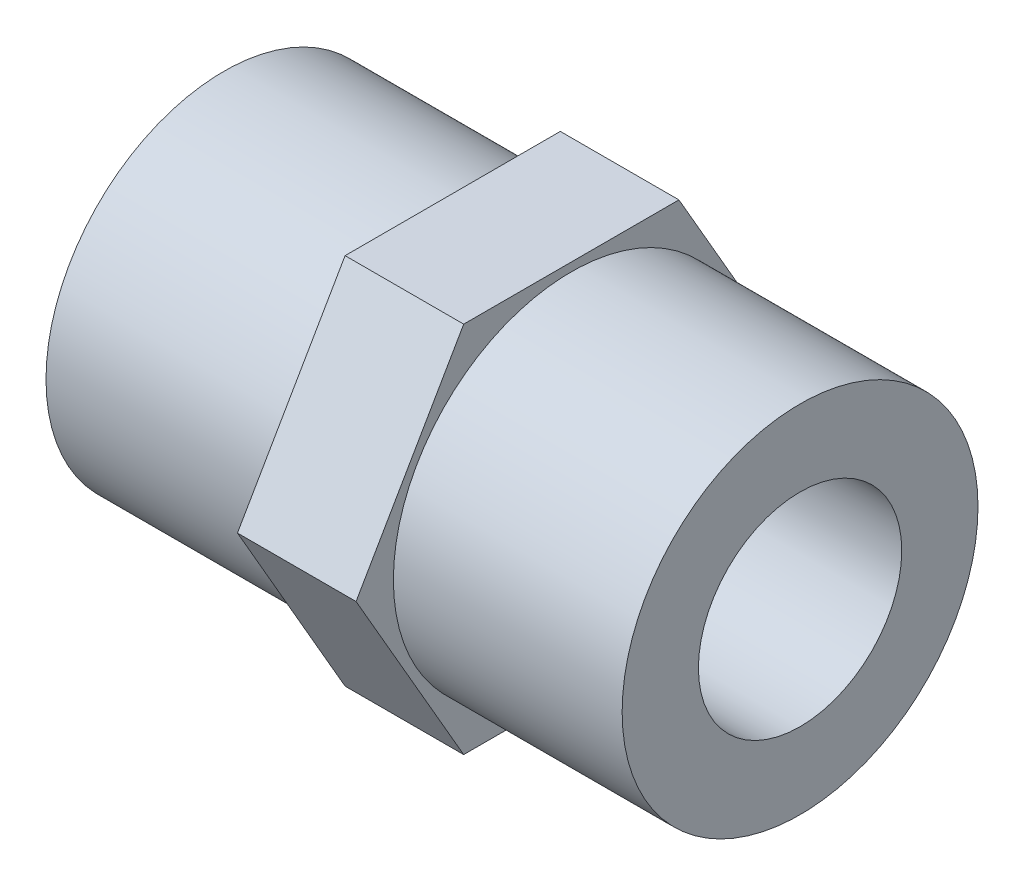
ISO-10303-21;
HEADER;
FILE_DESCRIPTION(('STEP AP214'),'2;1');
FILE_NAME('part.step','',(''),(''),'','','');
FILE_SCHEMA(('AUTOMOTIVE_DESIGN { 1 0 10303 214 1 1 1 1 }'));
ENDSEC;
DATA;
#1=APPLICATION_CONTEXT('core data for automotive mechanical design processes');
#2=APPLICATION_PROTOCOL_DEFINITION('international standard','automotive_design',2000,#1);
#3=PRODUCT_CONTEXT('',#1,'mechanical');
#4=PRODUCT('Part','Part','',(#3));
#5=PRODUCT_RELATED_PRODUCT_CATEGORY('part','',(#4));
#6=PRODUCT_DEFINITION_FORMATION('','',#4);
#7=PRODUCT_DEFINITION_CONTEXT('part definition',#1,'design');
#8=PRODUCT_DEFINITION('design','',#6,#7);
#9=PRODUCT_DEFINITION_SHAPE('','',#8);
#10=(LENGTH_UNIT() NAMED_UNIT(*) SI_UNIT(.MILLI.,.METRE.));
#11=(NAMED_UNIT(*) PLANE_ANGLE_UNIT() SI_UNIT($,.RADIAN.));
#12=(NAMED_UNIT(*) SI_UNIT($,.STERADIAN.) SOLID_ANGLE_UNIT());
#13=UNCERTAINTY_MEASURE_WITH_UNIT(LENGTH_MEASURE(1.E-05),#10,'distance_accuracy_value','');
#14=(GEOMETRIC_REPRESENTATION_CONTEXT(3) GLOBAL_UNCERTAINTY_ASSIGNED_CONTEXT((#13)) GLOBAL_UNIT_ASSIGNED_CONTEXT((#10,
#11,#12)) REPRESENTATION_CONTEXT('',''));
#15=CARTESIAN_POINT('',(0.,0.,0.));
#16=DIRECTION('',(0.,0.,1.));
#17=DIRECTION('',(1.,0.,0.));
#18=AXIS2_PLACEMENT_3D('',#15,#16,#17);
#19=CARTESIAN_POINT('',(0.,0.,0.));
#20=DIRECTION('',(-1.,0.,0.));
#21=DIRECTION('',(0.,0.,1.));
#22=AXIS2_PLACEMENT_3D('',#19,#20,#21);
#23=CYLINDRICAL_SURFACE('',#22,6.);
#24=CARTESIAN_POINT('',(34.,0.,0.));
#25=DIRECTION('',(-1.,0.,0.));
#26=DIRECTION('',(0.,0.,1.));
#27=AXIS2_PLACEMENT_3D('',#24,#25,#26);
#28=CIRCLE('',#27,6.);
#29=CARTESIAN_POINT('',(34.,0.,6.));
#30=VERTEX_POINT('',#29);
#31=EDGE_CURVE('E140',#30,#30,#28,.T.);
#32=ORIENTED_EDGE('',*,*,#31,.F.);
#33=EDGE_LOOP('',(#32));
#34=FACE_BOUND('',#33,.T.);
#35=CARTESIAN_POINT('',(0.,0.,0.));
#36=DIRECTION('',(-1.,0.,0.));
#37=DIRECTION('',(0.,0.,1.));
#38=AXIS2_PLACEMENT_3D('',#35,#36,#37);
#39=CIRCLE('',#38,6.);
#40=CARTESIAN_POINT('',(0.,0.,6.));
#41=VERTEX_POINT('',#40);
#42=EDGE_CURVE('E11',#41,#41,#39,.T.);
#43=ORIENTED_EDGE('',*,*,#42,.T.);
#44=EDGE_LOOP('',(#43));
#45=FACE_BOUND('',#44,.T.);
#46=ADVANCED_FACE('F33',(#34,#45),#23,.F.);
#47=CARTESIAN_POINT('',(0.,6.,0.));
#48=DIRECTION('',(1.,0.,0.));
#49=DIRECTION('',(0.,0.,-1.));
#50=AXIS2_PLACEMENT_3D('',#47,#48,#49);
#51=PLANE('',#50);
#52=ORIENTED_EDGE('',*,*,#42,.F.);
#53=EDGE_LOOP('',(#52));
#54=FACE_BOUND('',#53,.T.);
#55=CARTESIAN_POINT('',(0.,0.,0.));
#56=DIRECTION('',(-1.,0.,0.));
#57=DIRECTION('',(0.,0.,1.));
#58=AXIS2_PLACEMENT_3D('',#55,#56,#57);
#59=CIRCLE('',#58,10.5);
#60=CARTESIAN_POINT('',(0.,0.,10.5));
#61=VERTEX_POINT('',#60);
#62=EDGE_CURVE('E40',#61,#61,#59,.T.);
#63=ORIENTED_EDGE('',*,*,#62,.T.);
#64=EDGE_LOOP('',(#63));
#65=FACE_BOUND('',#64,.T.);
#66=ADVANCED_FACE('F154',(#54,#65),#51,.F.);
#67=CARTESIAN_POINT('',(0.,0.,0.));
#68=DIRECTION('',(-1.,0.,0.));
#69=DIRECTION('',(0.,0.,1.));
#70=AXIS2_PLACEMENT_3D('',#67,#68,#69);
#71=CYLINDRICAL_SURFACE('',#70,10.5);
#72=ORIENTED_EDGE('',*,*,#62,.F.);
#73=EDGE_LOOP('',(#72));
#74=FACE_BOUND('',#73,.T.);
#75=CARTESIAN_POINT('',(13.5,0.,0.));
#76=DIRECTION('',(-1.,0.,0.));
#77=DIRECTION('',(0.,0.,1.));
#78=AXIS2_PLACEMENT_3D('',#75,#76,#77);
#79=CIRCLE('',#78,10.5);
#80=CARTESIAN_POINT('',(13.5,0.,10.5));
#81=VERTEX_POINT('',#80);
#82=EDGE_CURVE('E149',#81,#81,#79,.T.);
#83=ORIENTED_EDGE('',*,*,#82,.T.);
#84=EDGE_LOOP('',(#83));
#85=FACE_BOUND('',#84,.T.);
#86=ADVANCED_FACE('F156',(#74,#85),#71,.T.);
#87=CARTESIAN_POINT('',(13.5,10.5,0.));
#88=DIRECTION('',(1.,0.,0.));
#89=DIRECTION('',(0.,0.,-1.));
#90=AXIS2_PLACEMENT_3D('',#87,#88,#89);
#91=PLANE('',#90);
#92=ORIENTED_EDGE('',*,*,#82,.F.);
#93=EDGE_LOOP('',(#92));
#94=FACE_BOUND('',#93,.T.);
#95=DIRECTION('',(0.,0.866025403784439,-0.5));
#96=VECTOR('',#95,1.);
#97=CARTESIAN_POINT('',(13.5,5.5,9.52627944162882));
#98=LINE('',#97,#96);
#99=CARTESIAN_POINT('',(13.5,0.,12.7017059221718));
#100=VERTEX_POINT('',#99);
#101=CARTESIAN_POINT('',(13.5,11.,6.35085296108588));
#102=VERTEX_POINT('',#101);
#103=EDGE_CURVE('E134',#100,#102,#98,.T.);
#104=ORIENTED_EDGE('',*,*,#103,.T.);
#105=DIRECTION('',(0.,0.,-1.));
#106=VECTOR('',#105,1.);
#107=CARTESIAN_POINT('',(13.5,11.,0.));
#108=LINE('',#107,#106);
#109=CARTESIAN_POINT('',(13.5,11.,-6.35085296108588));
#110=VERTEX_POINT('',#109);
#111=EDGE_CURVE('E130',#102,#110,#108,.T.);
#112=ORIENTED_EDGE('',*,*,#111,.T.);
#113=DIRECTION('',(0.,-0.866025403784439,-0.5));
#114=VECTOR('',#113,1.);
#115=CARTESIAN_POINT('',(13.5,5.5,-9.52627944162883));
#116=LINE('',#115,#114);
#117=CARTESIAN_POINT('',(13.5,0.,-12.7017059221718));
#118=VERTEX_POINT('',#117);
#119=EDGE_CURVE('E96',#110,#118,#116,.T.);
#120=ORIENTED_EDGE('',*,*,#119,.T.);
#121=DIRECTION('',(0.,-0.866025403784438,0.500000000000001));
#122=VECTOR('',#121,1.);
#123=CARTESIAN_POINT('',(13.5,-5.50000000000001,-9.52627944162882));
#124=LINE('',#123,#122);
#125=CARTESIAN_POINT('',(13.5,-11.,-6.35085296108588));
#126=VERTEX_POINT('',#125);
#127=EDGE_CURVE('E107',#118,#126,#124,.T.);
#128=ORIENTED_EDGE('',*,*,#127,.T.);
#129=DIRECTION('',(0.,0.,1.));
#130=VECTOR('',#129,1.);
#131=CARTESIAN_POINT('',(13.5,-11.,0.));
#132=LINE('',#131,#130);
#133=CARTESIAN_POINT('',(13.5,-11.,6.35085296108589));
#134=VERTEX_POINT('',#133);
#135=EDGE_CURVE('E118',#126,#134,#132,.T.);
#136=ORIENTED_EDGE('',*,*,#135,.T.);
#137=DIRECTION('',(0.,0.866025403784439,0.5));
#138=VECTOR('',#137,1.);
#139=CARTESIAN_POINT('',(13.5,-5.5,9.52627944162883));
#140=LINE('',#139,#138);
#141=EDGE_CURVE('E47',#134,#100,#140,.T.);
#142=ORIENTED_EDGE('',*,*,#141,.T.);
#143=EDGE_LOOP('',(#104,#112,#120,#128,#136,#142));
#144=FACE_BOUND('',#143,.T.);
#145=ADVANCED_FACE('F159',(#94,#144),#91,.F.);
#146=CARTESIAN_POINT('',(20.5,11.,0.));
#147=DIRECTION('',(-1.,0.,0.));
#148=DIRECTION('',(0.,0.,1.));
#149=AXIS2_PLACEMENT_3D('',#146,#147,#148);
#150=PLANE('',#149);
#151=DIRECTION('',(0.,0.866025403784438,-0.500000000000001));
#152=VECTOR('',#151,1.);
#153=CARTESIAN_POINT('',(20.5,-5.50000000000001,-9.52627944162882));
#154=LINE('',#153,#152);
#155=CARTESIAN_POINT('',(20.5,-11.,-6.35085296108588));
#156=VERTEX_POINT('',#155);
#157=CARTESIAN_POINT('',(20.5,0.,-12.7017059221718));
#158=VERTEX_POINT('',#157);
#159=EDGE_CURVE('E99',#156,#158,#154,.T.);
#160=ORIENTED_EDGE('',*,*,#159,.T.);
#161=DIRECTION('',(0.,0.866025403784439,0.5));
#162=VECTOR('',#161,1.);
#163=CARTESIAN_POINT('',(20.5,5.5,-9.52627944162883));
#164=LINE('',#163,#162);
#165=CARTESIAN_POINT('',(20.5,11.,-6.35085296108588));
#166=VERTEX_POINT('',#165);
#167=EDGE_CURVE('E86',#158,#166,#164,.T.);
#168=ORIENTED_EDGE('',*,*,#167,.T.);
#169=DIRECTION('',(0.,0.,1.));
#170=VECTOR('',#169,1.);
#171=CARTESIAN_POINT('',(20.5,11.,0.));
#172=LINE('',#171,#170);
#173=CARTESIAN_POINT('',(20.5,11.,6.35085296108588));
#174=VERTEX_POINT('',#173);
#175=EDGE_CURVE('E128',#166,#174,#172,.T.);
#176=ORIENTED_EDGE('',*,*,#175,.T.);
#177=DIRECTION('',(0.,-0.866025403784439,0.5));
#178=VECTOR('',#177,1.);
#179=CARTESIAN_POINT('',(20.5,5.5,9.52627944162882));
#180=LINE('',#179,#178);
#181=CARTESIAN_POINT('',(20.5,0.,12.7017059221718));
#182=VERTEX_POINT('',#181);
#183=EDGE_CURVE('E132',#174,#182,#180,.T.);
#184=ORIENTED_EDGE('',*,*,#183,.T.);
#185=DIRECTION('',(0.,-0.866025403784439,-0.5));
#186=VECTOR('',#185,1.);
#187=CARTESIAN_POINT('',(20.5,-5.5,9.52627944162883));
#188=LINE('',#187,#186);
#189=CARTESIAN_POINT('',(20.5,-11.,6.35085296108589));
#190=VERTEX_POINT('',#189);
#191=EDGE_CURVE('E136',#182,#190,#188,.T.);
#192=ORIENTED_EDGE('',*,*,#191,.T.);
#193=DIRECTION('',(0.,0.,-1.));
#194=VECTOR('',#193,1.);
#195=CARTESIAN_POINT('',(20.5,-11.,0.));
#196=LINE('',#195,#194);
#197=EDGE_CURVE('E103',#190,#156,#196,.T.);
#198=ORIENTED_EDGE('',*,*,#197,.T.);
#199=EDGE_LOOP('',(#160,#168,#176,#184,#192,#198));
#200=FACE_BOUND('',#199,.T.);
#201=CARTESIAN_POINT('',(20.5,0.,0.));
#202=DIRECTION('',(-1.,0.,0.));
#203=DIRECTION('',(0.,0.,1.));
#204=AXIS2_PLACEMENT_3D('',#201,#202,#203);
#205=CIRCLE('',#204,10.5);
#206=CARTESIAN_POINT('',(20.5,0.,10.5));
#207=VERTEX_POINT('',#206);
#208=EDGE_CURVE('E146',#207,#207,#205,.T.);
#209=ORIENTED_EDGE('',*,*,#208,.T.);
#210=EDGE_LOOP('',(#209));
#211=FACE_BOUND('',#210,.T.);
#212=ADVANCED_FACE('F100',(#200,#211),#150,.F.);
#213=CARTESIAN_POINT('',(0.,0.,0.));
#214=DIRECTION('',(-1.,0.,0.));
#215=DIRECTION('',(0.,0.,1.));
#216=AXIS2_PLACEMENT_3D('',#213,#214,#215);
#217=CYLINDRICAL_SURFACE('',#216,10.5);
#218=ORIENTED_EDGE('',*,*,#208,.F.);
#219=EDGE_LOOP('',(#218));
#220=FACE_BOUND('',#219,.T.);
#221=CARTESIAN_POINT('',(34.,0.,0.));
#222=DIRECTION('',(-1.,0.,0.));
#223=DIRECTION('',(0.,0.,1.));
#224=AXIS2_PLACEMENT_3D('',#221,#222,#223);
#225=CIRCLE('',#224,10.5);
#226=CARTESIAN_POINT('',(34.,0.,10.5));
#227=VERTEX_POINT('',#226);
#228=EDGE_CURVE('E143',#227,#227,#225,.T.);
#229=ORIENTED_EDGE('',*,*,#228,.T.);
#230=EDGE_LOOP('',(#229));
#231=FACE_BOUND('',#230,.T.);
#232=ADVANCED_FACE('F196',(#220,#231),#217,.T.);
#233=CARTESIAN_POINT('',(34.,10.5,0.));
#234=DIRECTION('',(-1.,0.,0.));
#235=DIRECTION('',(0.,0.,1.));
#236=AXIS2_PLACEMENT_3D('',#233,#234,#235);
#237=PLANE('',#236);
#238=ORIENTED_EDGE('',*,*,#228,.F.);
#239=EDGE_LOOP('',(#238));
#240=FACE_BOUND('',#239,.T.);
#241=ORIENTED_EDGE('',*,*,#31,.T.);
#242=EDGE_LOOP('',(#241));
#243=FACE_BOUND('',#242,.T.);
#244=ADVANCED_FACE('F194',(#240,#243),#237,.F.);
#245=CARTESIAN_POINT('',(2.05083700293626,-5.5,9.52627944162883));
#246=DIRECTION('',(0.,-0.5,0.866025403784439));
#247=DIRECTION('',(0.,-0.866025403784439,-0.5));
#248=AXIS2_PLACEMENT_3D('',#245,#246,#247);
#249=PLANE('',#248);
#250=ORIENTED_EDGE('',*,*,#141,.F.);
#251=DIRECTION('',(1.,0.,0.));
#252=VECTOR('',#251,1.);
#253=CARTESIAN_POINT('',(2.05083700293626,-11.,6.35085296108589));
#254=LINE('',#253,#252);
#255=EDGE_CURVE('E116',#134,#190,#254,.T.);
#256=ORIENTED_EDGE('',*,*,#255,.T.);
#257=ORIENTED_EDGE('',*,*,#191,.F.);
#258=DIRECTION('',(1.,0.,0.));
#259=VECTOR('',#258,1.);
#260=CARTESIAN_POINT('',(2.05083700293626,0.,12.7017059221718));
#261=LINE('',#260,#259);
#262=EDGE_CURVE('E54',#100,#182,#261,.T.);
#263=ORIENTED_EDGE('',*,*,#262,.F.);
#264=EDGE_LOOP('',(#250,#256,#257,#263));
#265=FACE_BOUND('',#264,.T.);
#266=ADVANCED_FACE('F172',(#265),#249,.T.);
#267=CARTESIAN_POINT('',(2.05083700293626,5.5,9.52627944162882));
#268=DIRECTION('',(0.,0.5,0.866025403784439));
#269=DIRECTION('',(0.,-0.866025403784439,0.5));
#270=AXIS2_PLACEMENT_3D('',#267,#268,#269);
#271=PLANE('',#270);
#272=ORIENTED_EDGE('',*,*,#103,.F.);
#273=ORIENTED_EDGE('',*,*,#262,.T.);
#274=ORIENTED_EDGE('',*,*,#183,.F.);
#275=DIRECTION('',(1.,0.,0.));
#276=VECTOR('',#275,1.);
#277=CARTESIAN_POINT('',(2.05083700293626,11.,6.35085296108588));
#278=LINE('',#277,#276);
#279=EDGE_CURVE('E125',#102,#174,#278,.T.);
#280=ORIENTED_EDGE('',*,*,#279,.F.);
#281=EDGE_LOOP('',(#272,#273,#274,#280));
#282=FACE_BOUND('',#281,.T.);
#283=ADVANCED_FACE('F169',(#282),#271,.T.);
#284=CARTESIAN_POINT('',(2.05083700293626,11.,0.));
#285=DIRECTION('',(0.,1.,0.));
#286=DIRECTION('',(0.,0.,1.));
#287=AXIS2_PLACEMENT_3D('',#284,#285,#286);
#288=PLANE('',#287);
#289=ORIENTED_EDGE('',*,*,#111,.F.);
#290=ORIENTED_EDGE('',*,*,#279,.T.);
#291=ORIENTED_EDGE('',*,*,#175,.F.);
#292=DIRECTION('',(1.,0.,0.));
#293=VECTOR('',#292,1.);
#294=CARTESIAN_POINT('',(2.05083700293626,11.,-6.35085296108588));
#295=LINE('',#294,#293);
#296=EDGE_CURVE('E93',#110,#166,#295,.T.);
#297=ORIENTED_EDGE('',*,*,#296,.F.);
#298=EDGE_LOOP('',(#289,#290,#291,#297));
#299=FACE_BOUND('',#298,.T.);
#300=ADVANCED_FACE('F168',(#299),#288,.T.);
#301=CARTESIAN_POINT('',(2.05083700293626,5.5,-9.52627944162883));
#302=DIRECTION('',(0.,0.5,-0.866025403784439));
#303=DIRECTION('',(0.,0.866025403784439,0.5));
#304=AXIS2_PLACEMENT_3D('',#301,#302,#303);
#305=PLANE('',#304);
#306=ORIENTED_EDGE('',*,*,#119,.F.);
#307=ORIENTED_EDGE('',*,*,#296,.T.);
#308=ORIENTED_EDGE('',*,*,#167,.F.);
#309=DIRECTION('',(1.,0.,0.));
#310=VECTOR('',#309,1.);
#311=CARTESIAN_POINT('',(2.05083700293626,0.,-12.7017059221718));
#312=LINE('',#311,#310);
#313=EDGE_CURVE('E91',#118,#158,#312,.T.);
#314=ORIENTED_EDGE('',*,*,#313,.F.);
#315=EDGE_LOOP('',(#306,#307,#308,#314));
#316=FACE_BOUND('',#315,.T.);
#317=ADVANCED_FACE('F89',(#316),#305,.T.);
#318=CARTESIAN_POINT('',(2.05083700293626,-11.,0.));
#319=DIRECTION('',(0.,-1.,0.));
#320=DIRECTION('',(0.,0.,-1.));
#321=AXIS2_PLACEMENT_3D('',#318,#319,#320);
#322=PLANE('',#321);
#323=ORIENTED_EDGE('',*,*,#135,.F.);
#324=DIRECTION('',(1.,0.,0.));
#325=VECTOR('',#324,1.);
#326=CARTESIAN_POINT('',(2.05083700293626,-11.,-6.35085296108588));
#327=LINE('',#326,#325);
#328=EDGE_CURVE('E108',#126,#156,#327,.T.);
#329=ORIENTED_EDGE('',*,*,#328,.T.);
#330=ORIENTED_EDGE('',*,*,#197,.F.);
#331=ORIENTED_EDGE('',*,*,#255,.F.);
#332=EDGE_LOOP('',(#323,#329,#330,#331));
#333=FACE_BOUND('',#332,.T.);
#334=ADVANCED_FACE('F175',(#333),#322,.T.);
#335=CARTESIAN_POINT('',(2.05083700293626,-5.50000000000001,-9.52627944162882));
#336=DIRECTION('',(0.,-0.500000000000001,-0.866025403784438));
#337=DIRECTION('',(0.,0.866025403784438,-0.500000000000001));
#338=AXIS2_PLACEMENT_3D('',#335,#336,#337);
#339=PLANE('',#338);
#340=ORIENTED_EDGE('',*,*,#127,.F.);
#341=ORIENTED_EDGE('',*,*,#313,.T.);
#342=ORIENTED_EDGE('',*,*,#159,.F.);
#343=ORIENTED_EDGE('',*,*,#328,.F.);
#344=EDGE_LOOP('',(#340,#341,#342,#343));
#345=FACE_BOUND('',#344,.T.);
#346=ADVANCED_FACE('F111',(#345),#339,.T.);
#347=CLOSED_SHELL('',(#46,#66,#86,#145,#212,#232,#244,#266,#283,#300,#317,#334,#346));
#348=MANIFOLD_SOLID_BREP('B2',#347);
#349=ADVANCED_BREP_SHAPE_REPRESENTATION('',(#18,#348),#14);
#350=SHAPE_DEFINITION_REPRESENTATION(#9,#349);
ENDSEC;
END-ISO-10303-21;
